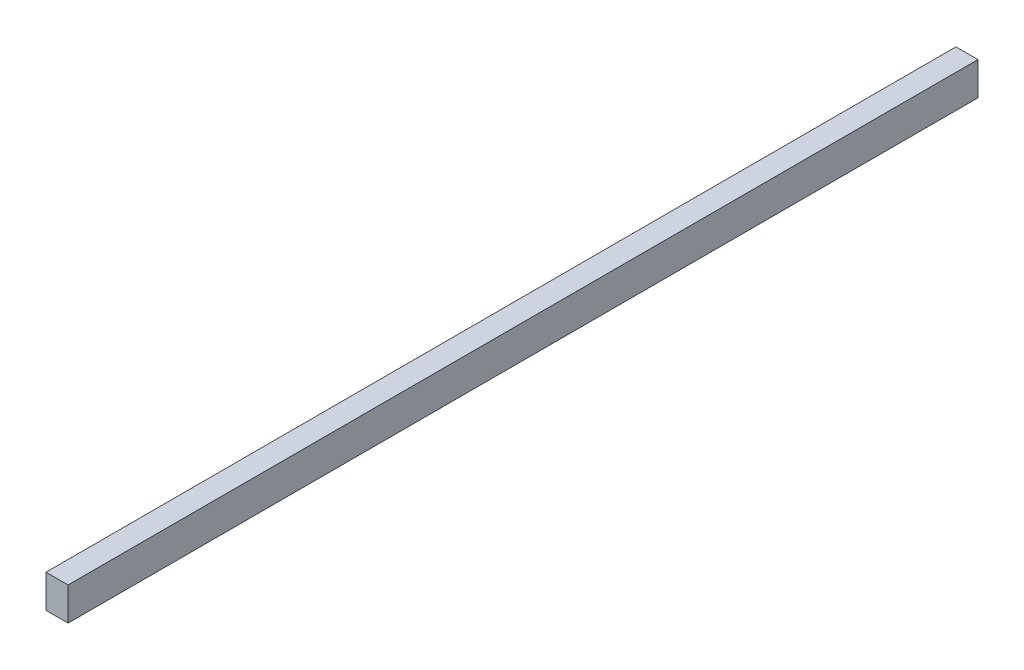
ISO-10303-21;
HEADER;
FILE_DESCRIPTION(('STEP AP214'),'2;1');
FILE_NAME('part.step','',(''),(''),'','','');
FILE_SCHEMA(('AUTOMOTIVE_DESIGN { 1 0 10303 214 1 1 1 1 }'));
ENDSEC;
DATA;
#1=APPLICATION_CONTEXT('core data for automotive mechanical design processes');
#2=APPLICATION_PROTOCOL_DEFINITION('international standard','automotive_design',2000,#1);
#3=PRODUCT_CONTEXT('',#1,'mechanical');
#4=PRODUCT('Part','Part','',(#3));
#5=PRODUCT_RELATED_PRODUCT_CATEGORY('part','',(#4));
#6=PRODUCT_DEFINITION_FORMATION('','',#4);
#7=PRODUCT_DEFINITION_CONTEXT('part definition',#1,'design');
#8=PRODUCT_DEFINITION('design','',#6,#7);
#9=PRODUCT_DEFINITION_SHAPE('','',#8);
#10=(LENGTH_UNIT() NAMED_UNIT(*) SI_UNIT(.MILLI.,.METRE.));
#11=(NAMED_UNIT(*) PLANE_ANGLE_UNIT() SI_UNIT($,.RADIAN.));
#12=(NAMED_UNIT(*) SI_UNIT($,.STERADIAN.) SOLID_ANGLE_UNIT());
#13=UNCERTAINTY_MEASURE_WITH_UNIT(LENGTH_MEASURE(1.E-05),#10,'distance_accuracy_value','');
#14=(GEOMETRIC_REPRESENTATION_CONTEXT(3) GLOBAL_UNCERTAINTY_ASSIGNED_CONTEXT((#13)) GLOBAL_UNIT_ASSIGNED_CONTEXT((#10,
#11,#12)) REPRESENTATION_CONTEXT('',''));
#15=CARTESIAN_POINT('',(0.,0.,0.));
#16=DIRECTION('',(0.,0.,1.));
#17=DIRECTION('',(1.,0.,0.));
#18=AXIS2_PLACEMENT_3D('',#15,#16,#17);
#19=CARTESIAN_POINT('',(12.,0.,0.));
#20=DIRECTION('',(0.,0.,-1.));
#21=DIRECTION('',(-1.,0.,0.));
#22=AXIS2_PLACEMENT_3D('',#19,#20,#21);
#23=PLANE('',#22);
#24=DIRECTION('',(0.,-1.,0.));
#25=VECTOR('',#24,1.);
#26=CARTESIAN_POINT('',(0.,0.,0.));
#27=LINE('',#26,#25);
#28=CARTESIAN_POINT('',(0.,18.,0.));
#29=VERTEX_POINT('',#28);
#30=CARTESIAN_POINT('',(0.,0.,0.));
#31=VERTEX_POINT('',#30);
#32=EDGE_CURVE('E96',#29,#31,#27,.T.);
#33=ORIENTED_EDGE('',*,*,#32,.T.);
#34=DIRECTION('',(-1.,0.,0.));
#35=VECTOR('',#34,1.);
#36=CARTESIAN_POINT('',(12.,0.,0.));
#37=LINE('',#36,#35);
#38=CARTESIAN_POINT('',(12.,0.,0.));
#39=VERTEX_POINT('',#38);
#40=EDGE_CURVE('E11',#39,#31,#37,.T.);
#41=ORIENTED_EDGE('',*,*,#40,.F.);
#42=DIRECTION('',(0.,-1.,0.));
#43=VECTOR('',#42,1.);
#44=CARTESIAN_POINT('',(12.,0.,0.));
#45=LINE('',#44,#43);
#46=CARTESIAN_POINT('',(12.,18.,0.));
#47=VERTEX_POINT('',#46);
#48=EDGE_CURVE('E84',#47,#39,#45,.T.);
#49=ORIENTED_EDGE('',*,*,#48,.F.);
#50=DIRECTION('',(-1.,0.,0.));
#51=VECTOR('',#50,1.);
#52=CARTESIAN_POINT('',(12.,18.,0.));
#53=LINE('',#52,#51);
#54=EDGE_CURVE('E92',#47,#29,#53,.T.);
#55=ORIENTED_EDGE('',*,*,#54,.T.);
#56=EDGE_LOOP('',(#33,#41,#49,#55));
#57=FACE_BOUND('',#56,.T.);
#58=ADVANCED_FACE('F33',(#57),#23,.F.);
#59=CARTESIAN_POINT('',(12.,0.,0.));
#60=DIRECTION('',(0.,1.,0.));
#61=DIRECTION('',(0.,0.,1.));
#62=AXIS2_PLACEMENT_3D('',#59,#60,#61);
#63=PLANE('',#62);
#64=DIRECTION('',(0.,0.,-1.));
#65=VECTOR('',#64,1.);
#66=CARTESIAN_POINT('',(0.,0.,0.));
#67=LINE('',#66,#65);
#68=CARTESIAN_POINT('',(0.,0.,-495.));
#69=VERTEX_POINT('',#68);
#70=EDGE_CURVE('E88',#31,#69,#67,.T.);
#71=ORIENTED_EDGE('',*,*,#70,.T.);
#72=DIRECTION('',(-1.,0.,0.));
#73=VECTOR('',#72,1.);
#74=CARTESIAN_POINT('',(12.,0.,-495.));
#75=LINE('',#74,#73);
#76=CARTESIAN_POINT('',(12.,0.,-495.));
#77=VERTEX_POINT('',#76);
#78=EDGE_CURVE('E41',#77,#69,#75,.T.);
#79=ORIENTED_EDGE('',*,*,#78,.F.);
#80=DIRECTION('',(0.,0.,-1.));
#81=VECTOR('',#80,1.);
#82=CARTESIAN_POINT('',(12.,0.,0.));
#83=LINE('',#82,#81);
#84=EDGE_CURVE('E79',#39,#77,#83,.T.);
#85=ORIENTED_EDGE('',*,*,#84,.F.);
#86=ORIENTED_EDGE('',*,*,#40,.T.);
#87=EDGE_LOOP('',(#71,#79,#85,#86));
#88=FACE_BOUND('',#87,.T.);
#89=ADVANCED_FACE('F87',(#88),#63,.F.);
#90=CARTESIAN_POINT('',(12.,0.,-495.));
#91=DIRECTION('',(0.,0.,1.));
#92=DIRECTION('',(1.,0.,0.));
#93=AXIS2_PLACEMENT_3D('',#90,#91,#92);
#94=PLANE('',#93);
#95=DIRECTION('',(0.,1.,0.));
#96=VECTOR('',#95,1.);
#97=CARTESIAN_POINT('',(0.,0.,-495.));
#98=LINE('',#97,#96);
#99=CARTESIAN_POINT('',(0.,18.,-495.));
#100=VERTEX_POINT('',#99);
#101=EDGE_CURVE('E66',#69,#100,#98,.T.);
#102=ORIENTED_EDGE('',*,*,#101,.T.);
#103=DIRECTION('',(-1.,0.,0.));
#104=VECTOR('',#103,1.);
#105=CARTESIAN_POINT('',(12.,18.,-495.));
#106=LINE('',#105,#104);
#107=CARTESIAN_POINT('',(12.,18.,-495.));
#108=VERTEX_POINT('',#107);
#109=EDGE_CURVE('E89',#108,#100,#106,.T.);
#110=ORIENTED_EDGE('',*,*,#109,.F.);
#111=DIRECTION('',(0.,1.,0.));
#112=VECTOR('',#111,1.);
#113=CARTESIAN_POINT('',(12.,0.,-495.));
#114=LINE('',#113,#112);
#115=EDGE_CURVE('E82',#77,#108,#114,.T.);
#116=ORIENTED_EDGE('',*,*,#115,.F.);
#117=ORIENTED_EDGE('',*,*,#78,.T.);
#118=EDGE_LOOP('',(#102,#110,#116,#117));
#119=FACE_BOUND('',#118,.T.);
#120=ADVANCED_FACE('F90',(#119),#94,.F.);
#121=CARTESIAN_POINT('',(12.,18.,0.));
#122=DIRECTION('',(0.,-1.,0.));
#123=DIRECTION('',(0.,0.,-1.));
#124=AXIS2_PLACEMENT_3D('',#121,#122,#123);
#125=PLANE('',#124);
#126=DIRECTION('',(0.,0.,1.));
#127=VECTOR('',#126,1.);
#128=CARTESIAN_POINT('',(0.,18.,0.));
#129=LINE('',#128,#127);
#130=EDGE_CURVE('E72',#100,#29,#129,.T.);
#131=ORIENTED_EDGE('',*,*,#130,.T.);
#132=ORIENTED_EDGE('',*,*,#54,.F.);
#133=DIRECTION('',(0.,0.,1.));
#134=VECTOR('',#133,1.);
#135=CARTESIAN_POINT('',(12.,18.,0.));
#136=LINE('',#135,#134);
#137=EDGE_CURVE('E49',#108,#47,#136,.T.);
#138=ORIENTED_EDGE('',*,*,#137,.F.);
#139=ORIENTED_EDGE('',*,*,#109,.T.);
#140=EDGE_LOOP('',(#131,#132,#138,#139));
#141=FACE_BOUND('',#140,.T.);
#142=ADVANCED_FACE('F103',(#141),#125,.F.);
#143=CARTESIAN_POINT('',(12.,0.,0.));
#144=DIRECTION('',(-1.,0.,0.));
#145=DIRECTION('',(0.,0.,1.));
#146=AXIS2_PLACEMENT_3D('',#143,#144,#145);
#147=PLANE('',#146);
#148=ORIENTED_EDGE('',*,*,#48,.T.);
#149=ORIENTED_EDGE('',*,*,#84,.T.);
#150=ORIENTED_EDGE('',*,*,#115,.T.);
#151=ORIENTED_EDGE('',*,*,#137,.T.);
#152=EDGE_LOOP('',(#148,#149,#150,#151));
#153=FACE_BOUND('',#152,.T.);
#154=ADVANCED_FACE('F80',(#153),#147,.F.);
#155=CARTESIAN_POINT('',(0.,0.,0.));
#156=DIRECTION('',(-1.,0.,0.));
#157=DIRECTION('',(0.,0.,1.));
#158=AXIS2_PLACEMENT_3D('',#155,#156,#157);
#159=PLANE('',#158);
#160=ORIENTED_EDGE('',*,*,#32,.F.);
#161=ORIENTED_EDGE('',*,*,#130,.F.);
#162=ORIENTED_EDGE('',*,*,#101,.F.);
#163=ORIENTED_EDGE('',*,*,#70,.F.);
#164=EDGE_LOOP('',(#160,#161,#162,#163));
#165=FACE_BOUND('',#164,.T.);
#166=ADVANCED_FACE('F106',(#165),#159,.T.);
#167=CLOSED_SHELL('',(#58,#89,#120,#142,#154,#166));
#168=MANIFOLD_SOLID_BREP('B2',#167);
#169=ADVANCED_BREP_SHAPE_REPRESENTATION('',(#18,#168),#14);
#170=SHAPE_DEFINITION_REPRESENTATION(#9,#169);
ENDSEC;
END-ISO-10303-21;
